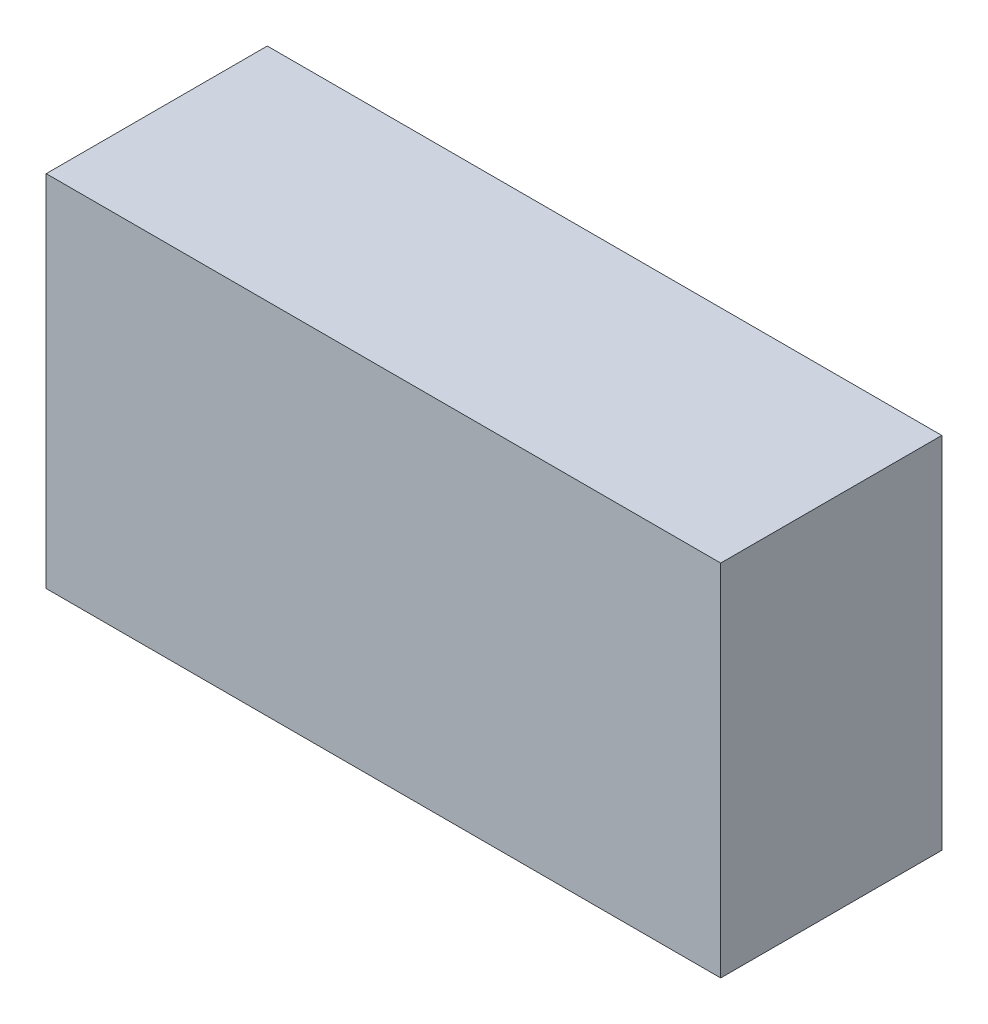
ISO-10303-21;
HEADER;
FILE_DESCRIPTION(('STEP AP214'),'2;1');
FILE_NAME('part.step','',(''),(''),'','','');
FILE_SCHEMA(('AUTOMOTIVE_DESIGN { 1 0 10303 214 1 1 1 1 }'));
ENDSEC;
DATA;
#1=APPLICATION_CONTEXT('core data for automotive mechanical design processes');
#2=APPLICATION_PROTOCOL_DEFINITION('international standard','automotive_design',2000,#1);
#3=PRODUCT_CONTEXT('',#1,'mechanical');
#4=PRODUCT('Part','Part','',(#3));
#5=PRODUCT_RELATED_PRODUCT_CATEGORY('part','',(#4));
#6=PRODUCT_DEFINITION_FORMATION('','',#4);
#7=PRODUCT_DEFINITION_CONTEXT('part definition',#1,'design');
#8=PRODUCT_DEFINITION('design','',#6,#7);
#9=PRODUCT_DEFINITION_SHAPE('','',#8);
#10=(LENGTH_UNIT() NAMED_UNIT(*) SI_UNIT(.MILLI.,.METRE.));
#11=(NAMED_UNIT(*) PLANE_ANGLE_UNIT() SI_UNIT($,.RADIAN.));
#12=(NAMED_UNIT(*) SI_UNIT($,.STERADIAN.) SOLID_ANGLE_UNIT());
#13=UNCERTAINTY_MEASURE_WITH_UNIT(LENGTH_MEASURE(1.E-05),#10,'distance_accuracy_value','');
#14=(GEOMETRIC_REPRESENTATION_CONTEXT(3) GLOBAL_UNCERTAINTY_ASSIGNED_CONTEXT((#13)) GLOBAL_UNIT_ASSIGNED_CONTEXT((#10,
#11,#12)) REPRESENTATION_CONTEXT('',''));
#15=CARTESIAN_POINT('',(0.,0.,0.));
#16=DIRECTION('',(0.,0.,1.));
#17=DIRECTION('',(1.,0.,0.));
#18=AXIS2_PLACEMENT_3D('',#15,#16,#17);
#19=CARTESIAN_POINT('',(-1.5254,-0.8,1.));
#20=DIRECTION('',(1.,0.,0.));
#21=DIRECTION('',(0.,0.,-1.));
#22=AXIS2_PLACEMENT_3D('',#19,#20,#21);
#23=PLANE('',#22);
#24=DIRECTION('',(0.,-1.,0.));
#25=VECTOR('',#24,1.);
#26=CARTESIAN_POINT('',(-1.5254,-0.8,0.));
#27=LINE('',#26,#25);
#28=CARTESIAN_POINT('',(-1.5254,0.8254,0.));
#29=VERTEX_POINT('',#28);
#30=CARTESIAN_POINT('',(-1.5254,-0.8,0.));
#31=VERTEX_POINT('',#30);
#32=EDGE_CURVE('E96',#29,#31,#27,.T.);
#33=ORIENTED_EDGE('',*,*,#32,.T.);
#34=DIRECTION('',(0.,0.,-1.));
#35=VECTOR('',#34,1.);
#36=CARTESIAN_POINT('',(-1.5254,-0.8,1.));
#37=LINE('',#36,#35);
#38=CARTESIAN_POINT('',(-1.5254,-0.8,1.));
#39=VERTEX_POINT('',#38);
#40=EDGE_CURVE('E11',#39,#31,#37,.T.);
#41=ORIENTED_EDGE('',*,*,#40,.F.);
#42=DIRECTION('',(0.,-1.,0.));
#43=VECTOR('',#42,1.);
#44=CARTESIAN_POINT('',(-1.5254,-0.8,1.));
#45=LINE('',#44,#43);
#46=CARTESIAN_POINT('',(-1.5254,0.8254,1.));
#47=VERTEX_POINT('',#46);
#48=EDGE_CURVE('E84',#47,#39,#45,.T.);
#49=ORIENTED_EDGE('',*,*,#48,.F.);
#50=DIRECTION('',(0.,0.,-1.));
#51=VECTOR('',#50,1.);
#52=CARTESIAN_POINT('',(-1.5254,0.8254,1.));
#53=LINE('',#52,#51);
#54=EDGE_CURVE('E92',#47,#29,#53,.T.);
#55=ORIENTED_EDGE('',*,*,#54,.T.);
#56=EDGE_LOOP('',(#33,#41,#49,#55));
#57=FACE_BOUND('',#56,.T.);
#58=ADVANCED_FACE('F33',(#57),#23,.F.);
#59=CARTESIAN_POINT('',(1.5254,-0.8,1.));
#60=DIRECTION('',(0.,1.,0.));
#61=DIRECTION('',(0.,0.,1.));
#62=AXIS2_PLACEMENT_3D('',#59,#60,#61);
#63=PLANE('',#62);
#64=DIRECTION('',(1.,0.,0.));
#65=VECTOR('',#64,1.);
#66=CARTESIAN_POINT('',(1.5254,-0.8,0.));
#67=LINE('',#66,#65);
#68=CARTESIAN_POINT('',(1.5254,-0.8,0.));
#69=VERTEX_POINT('',#68);
#70=EDGE_CURVE('E88',#31,#69,#67,.T.);
#71=ORIENTED_EDGE('',*,*,#70,.T.);
#72=DIRECTION('',(0.,0.,-1.));
#73=VECTOR('',#72,1.);
#74=CARTESIAN_POINT('',(1.5254,-0.8,1.));
#75=LINE('',#74,#73);
#76=CARTESIAN_POINT('',(1.5254,-0.8,1.));
#77=VERTEX_POINT('',#76);
#78=EDGE_CURVE('E41',#77,#69,#75,.T.);
#79=ORIENTED_EDGE('',*,*,#78,.F.);
#80=DIRECTION('',(1.,0.,0.));
#81=VECTOR('',#80,1.);
#82=CARTESIAN_POINT('',(1.5254,-0.8,1.));
#83=LINE('',#82,#81);
#84=EDGE_CURVE('E79',#39,#77,#83,.T.);
#85=ORIENTED_EDGE('',*,*,#84,.F.);
#86=ORIENTED_EDGE('',*,*,#40,.T.);
#87=EDGE_LOOP('',(#71,#79,#85,#86));
#88=FACE_BOUND('',#87,.T.);
#89=ADVANCED_FACE('F87',(#88),#63,.F.);
#90=CARTESIAN_POINT('',(1.5254,0.8254,1.));
#91=DIRECTION('',(-1.,0.,0.));
#92=DIRECTION('',(0.,0.,1.));
#93=AXIS2_PLACEMENT_3D('',#90,#91,#92);
#94=PLANE('',#93);
#95=DIRECTION('',(0.,1.,0.));
#96=VECTOR('',#95,1.);
#97=CARTESIAN_POINT('',(1.5254,0.8254,0.));
#98=LINE('',#97,#96);
#99=CARTESIAN_POINT('',(1.5254,0.8254,0.));
#100=VERTEX_POINT('',#99);
#101=EDGE_CURVE('E66',#69,#100,#98,.T.);
#102=ORIENTED_EDGE('',*,*,#101,.T.);
#103=DIRECTION('',(0.,0.,-1.));
#104=VECTOR('',#103,1.);
#105=CARTESIAN_POINT('',(1.5254,0.8254,1.));
#106=LINE('',#105,#104);
#107=CARTESIAN_POINT('',(1.5254,0.8254,1.));
#108=VERTEX_POINT('',#107);
#109=EDGE_CURVE('E89',#108,#100,#106,.T.);
#110=ORIENTED_EDGE('',*,*,#109,.F.);
#111=DIRECTION('',(0.,1.,0.));
#112=VECTOR('',#111,1.);
#113=CARTESIAN_POINT('',(1.5254,0.8254,1.));
#114=LINE('',#113,#112);
#115=EDGE_CURVE('E82',#77,#108,#114,.T.);
#116=ORIENTED_EDGE('',*,*,#115,.F.);
#117=ORIENTED_EDGE('',*,*,#78,.T.);
#118=EDGE_LOOP('',(#102,#110,#116,#117));
#119=FACE_BOUND('',#118,.T.);
#120=ADVANCED_FACE('F90',(#119),#94,.F.);
#121=CARTESIAN_POINT('',(-1.5254,0.8254,1.));
#122=DIRECTION('',(0.,-1.,0.));
#123=DIRECTION('',(0.,0.,-1.));
#124=AXIS2_PLACEMENT_3D('',#121,#122,#123);
#125=PLANE('',#124);
#126=DIRECTION('',(-1.,0.,0.));
#127=VECTOR('',#126,1.);
#128=CARTESIAN_POINT('',(-1.5254,0.8254,0.));
#129=LINE('',#128,#127);
#130=EDGE_CURVE('E72',#100,#29,#129,.T.);
#131=ORIENTED_EDGE('',*,*,#130,.T.);
#132=ORIENTED_EDGE('',*,*,#54,.F.);
#133=DIRECTION('',(-1.,0.,0.));
#134=VECTOR('',#133,1.);
#135=CARTESIAN_POINT('',(-1.5254,0.8254,1.));
#136=LINE('',#135,#134);
#137=EDGE_CURVE('E49',#108,#47,#136,.T.);
#138=ORIENTED_EDGE('',*,*,#137,.F.);
#139=ORIENTED_EDGE('',*,*,#109,.T.);
#140=EDGE_LOOP('',(#131,#132,#138,#139));
#141=FACE_BOUND('',#140,.T.);
#142=ADVANCED_FACE('F103',(#141),#125,.F.);
#143=CARTESIAN_POINT('',(0.,0.,1.));
#144=DIRECTION('',(0.,0.,-1.));
#145=DIRECTION('',(-1.,0.,0.));
#146=AXIS2_PLACEMENT_3D('',#143,#144,#145);
#147=PLANE('',#146);
#148=ORIENTED_EDGE('',*,*,#48,.T.);
#149=ORIENTED_EDGE('',*,*,#84,.T.);
#150=ORIENTED_EDGE('',*,*,#115,.T.);
#151=ORIENTED_EDGE('',*,*,#137,.T.);
#152=EDGE_LOOP('',(#148,#149,#150,#151));
#153=FACE_BOUND('',#152,.T.);
#154=ADVANCED_FACE('F80',(#153),#147,.F.);
#155=CARTESIAN_POINT('',(0.,0.,0.));
#156=DIRECTION('',(0.,0.,-1.));
#157=DIRECTION('',(-1.,0.,0.));
#158=AXIS2_PLACEMENT_3D('',#155,#156,#157);
#159=PLANE('',#158);
#160=ORIENTED_EDGE('',*,*,#32,.F.);
#161=ORIENTED_EDGE('',*,*,#130,.F.);
#162=ORIENTED_EDGE('',*,*,#101,.F.);
#163=ORIENTED_EDGE('',*,*,#70,.F.);
#164=EDGE_LOOP('',(#160,#161,#162,#163));
#165=FACE_BOUND('',#164,.T.);
#166=ADVANCED_FACE('F106',(#165),#159,.T.);
#167=CLOSED_SHELL('',(#58,#89,#120,#142,#154,#166));
#168=MANIFOLD_SOLID_BREP('B2',#167);
#169=ADVANCED_BREP_SHAPE_REPRESENTATION('',(#18,#168),#14);
#170=SHAPE_DEFINITION_REPRESENTATION(#9,#169);
ENDSEC;
END-ISO-10303-21;
